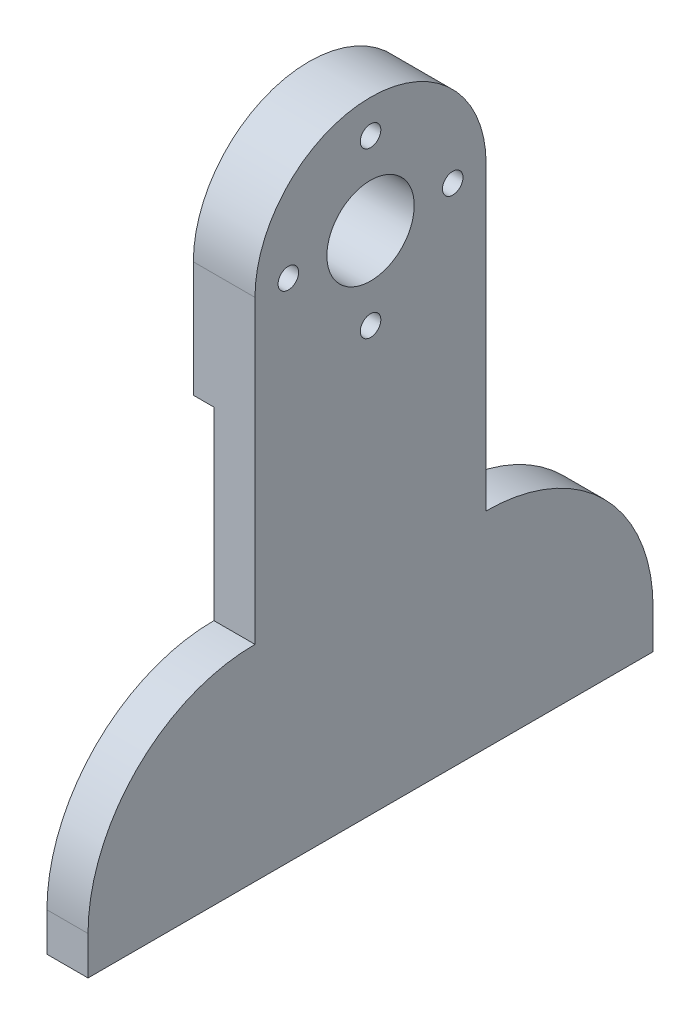
ISO-10303-21;
HEADER;
FILE_DESCRIPTION(('STEP AP214'),'2;1');
FILE_NAME('part.step','',(''),(''),'','','');
FILE_SCHEMA(('AUTOMOTIVE_DESIGN { 1 0 10303 214 1 1 1 1 }'));
ENDSEC;
DATA;
#1=APPLICATION_CONTEXT('core data for automotive mechanical design processes');
#2=APPLICATION_PROTOCOL_DEFINITION('international standard','automotive_design',2000,#1);
#3=PRODUCT_CONTEXT('',#1,'mechanical');
#4=PRODUCT('Part','Part','',(#3));
#5=PRODUCT_RELATED_PRODUCT_CATEGORY('part','',(#4));
#6=PRODUCT_DEFINITION_FORMATION('','',#4);
#7=PRODUCT_DEFINITION_CONTEXT('part definition',#1,'design');
#8=PRODUCT_DEFINITION('design','',#6,#7);
#9=PRODUCT_DEFINITION_SHAPE('','',#8);
#10=(LENGTH_UNIT() NAMED_UNIT(*) SI_UNIT(.MILLI.,.METRE.));
#11=(NAMED_UNIT(*) PLANE_ANGLE_UNIT() SI_UNIT($,.RADIAN.));
#12=(NAMED_UNIT(*) SI_UNIT($,.STERADIAN.) SOLID_ANGLE_UNIT());
#13=UNCERTAINTY_MEASURE_WITH_UNIT(LENGTH_MEASURE(1.E-05),#10,'distance_accuracy_value','');
#14=(GEOMETRIC_REPRESENTATION_CONTEXT(3) GLOBAL_UNCERTAINTY_ASSIGNED_CONTEXT((#13)) GLOBAL_UNIT_ASSIGNED_CONTEXT((#10,
#11,#12)) REPRESENTATION_CONTEXT('',''));
#15=CARTESIAN_POINT('',(0.,0.,0.));
#16=DIRECTION('',(0.,0.,1.));
#17=DIRECTION('',(1.,0.,0.));
#18=AXIS2_PLACEMENT_3D('',#15,#16,#17);
#19=CARTESIAN_POINT('',(19.,0.,-55.));
#20=DIRECTION('',(1.,0.,0.));
#21=DIRECTION('',(0.,1.,0.));
#22=AXIS2_PLACEMENT_3D('',#19,#20,#21);
#23=PLANE('',#22);
#24=CARTESIAN_POINT('',(19.,-12.75,-19.5000000000001));
#25=DIRECTION('',(1.,0.,0.));
#26=DIRECTION('',(0.,1.,0.));
#27=AXIS2_PLACEMENT_3D('',#24,#25,#26);
#28=CIRCLE('',#27,1.);
#29=CARTESIAN_POINT('',(19.,-11.75,-19.5000000000001));
#30=VERTEX_POINT('',#29);
#31=EDGE_CURVE('E257',#30,#30,#28,.F.);
#32=ORIENTED_EDGE('',*,*,#31,.F.);
#33=EDGE_LOOP('',(#32));
#34=FACE_BOUND('',#33,.T.);
#35=CARTESIAN_POINT('',(19.,-20.75,-27.5000000000002));
#36=DIRECTION('',(1.,0.,0.));
#37=DIRECTION('',(0.,1.,0.));
#38=AXIS2_PLACEMENT_3D('',#35,#36,#37);
#39=CIRCLE('',#38,1.);
#40=CARTESIAN_POINT('',(19.,-19.75,-27.5000000000002));
#41=VERTEX_POINT('',#40);
#42=EDGE_CURVE('E241',#41,#41,#39,.F.);
#43=ORIENTED_EDGE('',*,*,#42,.F.);
#44=EDGE_LOOP('',(#43));
#45=FACE_BOUND('',#44,.T.);
#46=CARTESIAN_POINT('',(19.,-4.75000000000001,-27.5));
#47=DIRECTION('',(1.,0.,0.));
#48=DIRECTION('',(0.,1.,0.));
#49=AXIS2_PLACEMENT_3D('',#46,#47,#48);
#50=CIRCLE('',#49,1.);
#51=CARTESIAN_POINT('',(19.,-3.75000000000001,-27.5));
#52=VERTEX_POINT('',#51);
#53=EDGE_CURVE('E225',#52,#52,#50,.F.);
#54=ORIENTED_EDGE('',*,*,#53,.F.);
#55=EDGE_LOOP('',(#54));
#56=FACE_BOUND('',#55,.T.);
#57=CARTESIAN_POINT('',(19.,-12.7499999999999,-35.5000000000001));
#58=DIRECTION('',(1.,0.,0.));
#59=DIRECTION('',(0.,1.,0.));
#60=AXIS2_PLACEMENT_3D('',#57,#58,#59);
#61=CIRCLE('',#60,1.00000000000001);
#62=CARTESIAN_POINT('',(19.,-11.7499999999999,-35.5000000000001));
#63=VERTEX_POINT('',#62);
#64=EDGE_CURVE('E233',#63,#63,#61,.F.);
#65=ORIENTED_EDGE('',*,*,#64,.F.);
#66=EDGE_LOOP('',(#65));
#67=FACE_BOUND('',#66,.T.);
#68=CARTESIAN_POINT('',(19.,-12.75,-27.5));
#69=DIRECTION('',(1.,0.,0.));
#70=DIRECTION('',(0.,1.,0.));
#71=AXIS2_PLACEMENT_3D('',#68,#69,#70);
#72=CIRCLE('',#71,4.25);
#73=CARTESIAN_POINT('',(19.,-8.50000000000001,-27.5));
#74=VERTEX_POINT('',#73);
#75=EDGE_CURVE('E249',#74,#74,#72,.F.);
#76=ORIENTED_EDGE('',*,*,#75,.F.);
#77=EDGE_LOOP('',(#76));
#78=FACE_BOUND('',#77,.T.);
#79=DIRECTION('',(0.,-1.,0.));
#80=VECTOR('',#79,1.);
#81=CARTESIAN_POINT('',(19.,0.,-38.75));
#82=LINE('',#81,#80);
#83=CARTESIAN_POINT('',(19.,-12.75,-38.75));
#84=VERTEX_POINT('',#83);
#85=CARTESIAN_POINT('',(19.,-24.,-38.75));
#86=VERTEX_POINT('',#85);
#87=EDGE_CURVE('E261',#84,#86,#82,.T.);
#88=ORIENTED_EDGE('',*,*,#87,.T.);
#89=DIRECTION('',(0.,0.,-1.));
#90=VECTOR('',#89,1.);
#91=CARTESIAN_POINT('',(19.,-24.,0.));
#92=LINE('',#91,#90);
#93=CARTESIAN_POINT('',(19.,-24.,-16.25));
#94=VERTEX_POINT('',#93);
#95=EDGE_CURVE('E200',#94,#86,#92,.T.);
#96=ORIENTED_EDGE('',*,*,#95,.F.);
#97=DIRECTION('',(0.,-1.,0.));
#98=VECTOR('',#97,1.);
#99=CARTESIAN_POINT('',(19.,0.,-16.25));
#100=LINE('',#99,#98);
#101=CARTESIAN_POINT('',(19.,-12.75,-16.25));
#102=VERTEX_POINT('',#101);
#103=EDGE_CURVE('E159',#102,#94,#100,.T.);
#104=ORIENTED_EDGE('',*,*,#103,.F.);
#105=CARTESIAN_POINT('',(19.,-12.75,-27.5));
#106=DIRECTION('',(1.,0.,0.));
#107=DIRECTION('',(0.,1.,0.));
#108=AXIS2_PLACEMENT_3D('',#105,#106,#107);
#109=CIRCLE('',#108,11.25);
#110=EDGE_CURVE('E216',#84,#102,#109,.T.);
#111=ORIENTED_EDGE('',*,*,#110,.F.);
#112=EDGE_LOOP('',(#88,#96,#104,#111));
#113=FACE_BOUND('',#112,.T.);
#114=ADVANCED_FACE('F47',(#34,#45,#56,#67,#78,#113),#23,.F.);
#115=CARTESIAN_POINT('',(-25.,-12.75,-19.5000000000001));
#116=DIRECTION('',(1.,0.,0.));
#117=DIRECTION('',(0.,1.,0.));
#118=AXIS2_PLACEMENT_3D('',#115,#116,#117);
#119=CYLINDRICAL_SURFACE('',#118,1.);
#120=ORIENTED_EDGE('',*,*,#31,.T.);
#121=EDGE_LOOP('',(#120));
#122=FACE_BOUND('',#121,.T.);
#123=CARTESIAN_POINT('',(25.,-12.75,-19.5000000000001));
#124=DIRECTION('',(1.,0.,0.));
#125=DIRECTION('',(0.,1.,0.));
#126=AXIS2_PLACEMENT_3D('',#123,#124,#125);
#127=CIRCLE('',#126,1.);
#128=CARTESIAN_POINT('',(25.,-11.75,-19.5000000000001));
#129=VERTEX_POINT('',#128);
#130=EDGE_CURVE('E253',#129,#129,#127,.T.);
#131=ORIENTED_EDGE('',*,*,#130,.T.);
#132=EDGE_LOOP('',(#131));
#133=FACE_BOUND('',#132,.T.);
#134=ADVANCED_FACE('F299',(#122,#133),#119,.F.);
#135=CARTESIAN_POINT('',(-25.,-12.75,-27.5));
#136=DIRECTION('',(1.,0.,0.));
#137=DIRECTION('',(0.,1.,0.));
#138=AXIS2_PLACEMENT_3D('',#135,#136,#137);
#139=CYLINDRICAL_SURFACE('',#138,4.25);
#140=ORIENTED_EDGE('',*,*,#75,.T.);
#141=EDGE_LOOP('',(#140));
#142=FACE_BOUND('',#141,.T.);
#143=CARTESIAN_POINT('',(25.,-12.75,-27.5));
#144=DIRECTION('',(1.,0.,0.));
#145=DIRECTION('',(0.,1.,0.));
#146=AXIS2_PLACEMENT_3D('',#143,#144,#145);
#147=CIRCLE('',#146,4.25);
#148=CARTESIAN_POINT('',(25.,-8.50000000000001,-27.5));
#149=VERTEX_POINT('',#148);
#150=EDGE_CURVE('E245',#149,#149,#147,.T.);
#151=ORIENTED_EDGE('',*,*,#150,.T.);
#152=EDGE_LOOP('',(#151));
#153=FACE_BOUND('',#152,.T.);
#154=ADVANCED_FACE('F305',(#142,#153),#139,.F.);
#155=CARTESIAN_POINT('',(-25.,-20.75,-27.5000000000002));
#156=DIRECTION('',(1.,0.,0.));
#157=DIRECTION('',(0.,1.,0.));
#158=AXIS2_PLACEMENT_3D('',#155,#156,#157);
#159=CYLINDRICAL_SURFACE('',#158,1.);
#160=ORIENTED_EDGE('',*,*,#42,.T.);
#161=EDGE_LOOP('',(#160));
#162=FACE_BOUND('',#161,.T.);
#163=CARTESIAN_POINT('',(25.,-20.75,-27.5000000000002));
#164=DIRECTION('',(1.,0.,0.));
#165=DIRECTION('',(0.,1.,0.));
#166=AXIS2_PLACEMENT_3D('',#163,#164,#165);
#167=CIRCLE('',#166,1.);
#168=CARTESIAN_POINT('',(25.,-19.75,-27.5000000000002));
#169=VERTEX_POINT('',#168);
#170=EDGE_CURVE('E237',#169,#169,#167,.T.);
#171=ORIENTED_EDGE('',*,*,#170,.T.);
#172=EDGE_LOOP('',(#171));
#173=FACE_BOUND('',#172,.T.);
#174=ADVANCED_FACE('F320',(#162,#173),#159,.F.);
#175=CARTESIAN_POINT('',(-25.,-12.7499999999999,-35.5000000000001));
#176=DIRECTION('',(1.,0.,0.));
#177=DIRECTION('',(0.,1.,0.));
#178=AXIS2_PLACEMENT_3D('',#175,#176,#177);
#179=CYLINDRICAL_SURFACE('',#178,1.00000000000001);
#180=ORIENTED_EDGE('',*,*,#64,.T.);
#181=EDGE_LOOP('',(#180));
#182=FACE_BOUND('',#181,.T.);
#183=CARTESIAN_POINT('',(25.,-12.7499999999999,-35.5000000000001));
#184=DIRECTION('',(1.,0.,0.));
#185=DIRECTION('',(0.,1.,0.));
#186=AXIS2_PLACEMENT_3D('',#183,#184,#185);
#187=CIRCLE('',#186,1.00000000000001);
#188=CARTESIAN_POINT('',(25.,-11.7499999999999,-35.5000000000001));
#189=VERTEX_POINT('',#188);
#190=EDGE_CURVE('E229',#189,#189,#187,.T.);
#191=ORIENTED_EDGE('',*,*,#190,.T.);
#192=EDGE_LOOP('',(#191));
#193=FACE_BOUND('',#192,.T.);
#194=ADVANCED_FACE('F324',(#182,#193),#179,.F.);
#195=CARTESIAN_POINT('',(-25.,-4.75000000000001,-27.5));
#196=DIRECTION('',(1.,0.,0.));
#197=DIRECTION('',(0.,1.,0.));
#198=AXIS2_PLACEMENT_3D('',#195,#196,#197);
#199=CYLINDRICAL_SURFACE('',#198,1.);
#200=ORIENTED_EDGE('',*,*,#53,.T.);
#201=EDGE_LOOP('',(#200));
#202=FACE_BOUND('',#201,.T.);
#203=CARTESIAN_POINT('',(25.,-4.75000000000001,-27.5));
#204=DIRECTION('',(1.,0.,0.));
#205=DIRECTION('',(0.,1.,0.));
#206=AXIS2_PLACEMENT_3D('',#203,#204,#205);
#207=CIRCLE('',#206,1.);
#208=CARTESIAN_POINT('',(25.,-3.75,-27.5));
#209=VERTEX_POINT('',#208);
#210=EDGE_CURVE('E221',#209,#209,#207,.T.);
#211=ORIENTED_EDGE('',*,*,#210,.T.);
#212=EDGE_LOOP('',(#211));
#213=FACE_BOUND('',#212,.T.);
#214=ADVANCED_FACE('F294',(#202,#213),#199,.F.);
#215=CARTESIAN_POINT('',(-25.0000000000001,-12.75,-27.5));
#216=DIRECTION('',(1.,0.,0.));
#217=DIRECTION('',(0.,1.,0.));
#218=AXIS2_PLACEMENT_3D('',#215,#216,#217);
#219=CYLINDRICAL_SURFACE('',#218,11.25);
#220=ORIENTED_EDGE('',*,*,#110,.T.);
#221=DIRECTION('',(1.,0.,0.));
#222=VECTOR('',#221,1.);
#223=CARTESIAN_POINT('',(-25.0000000000001,-12.75,-16.25));
#224=LINE('',#223,#222);
#225=CARTESIAN_POINT('',(25.,-12.75,-16.25));
#226=VERTEX_POINT('',#225);
#227=EDGE_CURVE('E213',#102,#226,#224,.T.);
#228=ORIENTED_EDGE('',*,*,#227,.T.);
#229=CARTESIAN_POINT('',(25.,-12.75,-27.5));
#230=DIRECTION('',(1.,0.,0.));
#231=DIRECTION('',(0.,1.,0.));
#232=AXIS2_PLACEMENT_3D('',#229,#230,#231);
#233=CIRCLE('',#232,11.25);
#234=CARTESIAN_POINT('',(25.,-12.75,-38.75));
#235=VERTEX_POINT('',#234);
#236=EDGE_CURVE('E181',#235,#226,#233,.T.);
#237=ORIENTED_EDGE('',*,*,#236,.F.);
#238=DIRECTION('',(1.,0.,0.));
#239=VECTOR('',#238,1.);
#240=CARTESIAN_POINT('',(-25.0000000000001,-12.75,-38.75));
#241=LINE('',#240,#239);
#242=EDGE_CURVE('E189',#84,#235,#241,.T.);
#243=ORIENTED_EDGE('',*,*,#242,.F.);
#244=EDGE_LOOP('',(#220,#228,#237,#243));
#245=FACE_BOUND('',#244,.T.);
#246=ADVANCED_FACE('F286',(#245),#219,.T.);
#247=CARTESIAN_POINT('',(-25.0000000000001,-58.25,-38.75));
#248=DIRECTION('',(1.,0.,0.));
#249=DIRECTION('',(0.,1.,0.));
#250=AXIS2_PLACEMENT_3D('',#247,#248,#249);
#251=CYLINDRICAL_SURFACE('',#250,16.25);
#252=CARTESIAN_POINT('',(21.,-58.25,-38.75));
#253=DIRECTION('',(1.,0.,0.));
#254=DIRECTION('',(0.,1.,0.));
#255=AXIS2_PLACEMENT_3D('',#252,#253,#254);
#256=CIRCLE('',#255,16.25);
#257=CARTESIAN_POINT('',(21.,-42.,-38.75));
#258=VERTEX_POINT('',#257);
#259=CARTESIAN_POINT('',(21.,-58.25,-55.));
#260=VERTEX_POINT('',#259);
#261=EDGE_CURVE('E190',#258,#260,#256,.F.);
#262=ORIENTED_EDGE('',*,*,#261,.F.);
#263=DIRECTION('',(1.,0.,0.));
#264=VECTOR('',#263,1.);
#265=CARTESIAN_POINT('',(-25.0000000000001,-42.,-38.75));
#266=LINE('',#265,#264);
#267=CARTESIAN_POINT('',(25.,-42.,-38.75));
#268=VERTEX_POINT('',#267);
#269=EDGE_CURVE('E122',#258,#268,#266,.T.);
#270=ORIENTED_EDGE('',*,*,#269,.T.);
#271=CARTESIAN_POINT('',(25.,-58.25,-38.75));
#272=DIRECTION('',(1.,0.,0.));
#273=DIRECTION('',(0.,1.,0.));
#274=AXIS2_PLACEMENT_3D('',#271,#272,#273);
#275=CIRCLE('',#274,16.25);
#276=CARTESIAN_POINT('',(25.,-58.25,-55.));
#277=VERTEX_POINT('',#276);
#278=EDGE_CURVE('E185',#277,#268,#275,.T.);
#279=ORIENTED_EDGE('',*,*,#278,.F.);
#280=DIRECTION('',(1.,0.,0.));
#281=VECTOR('',#280,1.);
#282=CARTESIAN_POINT('',(-25.0000000000001,-58.25,-55.));
#283=LINE('',#282,#281);
#284=EDGE_CURVE('E58',#260,#277,#283,.T.);
#285=ORIENTED_EDGE('',*,*,#284,.F.);
#286=EDGE_LOOP('',(#262,#270,#279,#285));
#287=FACE_BOUND('',#286,.T.);
#288=ADVANCED_FACE('F283',(#287),#251,.T.);
#289=CARTESIAN_POINT('',(-25.0000000000001,0.,-38.75));
#290=DIRECTION('',(0.,0.,1.));
#291=DIRECTION('',(1.,0.,0.));
#292=AXIS2_PLACEMENT_3D('',#289,#290,#291);
#293=PLANE('',#292);
#294=DIRECTION('',(0.,1.,0.));
#295=VECTOR('',#294,1.);
#296=CARTESIAN_POINT('',(21.,0.,-38.75));
#297=LINE('',#296,#295);
#298=CARTESIAN_POINT('',(21.,-24.,-38.75));
#299=VERTEX_POINT('',#298);
#300=EDGE_CURVE('E113',#258,#299,#297,.T.);
#301=ORIENTED_EDGE('',*,*,#300,.T.);
#302=DIRECTION('',(1.,0.,0.));
#303=VECTOR('',#302,1.);
#304=CARTESIAN_POINT('',(21.,-24.,-38.75));
#305=LINE('',#304,#303);
#306=EDGE_CURVE('E205',#86,#299,#305,.T.);
#307=ORIENTED_EDGE('',*,*,#306,.F.);
#308=ORIENTED_EDGE('',*,*,#87,.F.);
#309=ORIENTED_EDGE('',*,*,#242,.T.);
#310=DIRECTION('',(0.,-1.,0.));
#311=VECTOR('',#310,1.);
#312=CARTESIAN_POINT('',(25.,0.,-38.75));
#313=LINE('',#312,#311);
#314=EDGE_CURVE('E201',#235,#268,#313,.T.);
#315=ORIENTED_EDGE('',*,*,#314,.T.);
#316=ORIENTED_EDGE('',*,*,#269,.F.);
#317=EDGE_LOOP('',(#301,#307,#308,#309,#315,#316));
#318=FACE_BOUND('',#317,.T.);
#319=ADVANCED_FACE('F285',(#318),#293,.F.);
#320=CARTESIAN_POINT('',(21.,-24.,0.));
#321=DIRECTION('',(0.,1.,0.));
#322=DIRECTION('',(0.,0.,1.));
#323=AXIS2_PLACEMENT_3D('',#320,#321,#322);
#324=PLANE('',#323);
#325=DIRECTION('',(-1.,0.,0.));
#326=VECTOR('',#325,1.);
#327=CARTESIAN_POINT('',(-25.0000000000001,-24.,-16.25));
#328=LINE('',#327,#326);
#329=CARTESIAN_POINT('',(21.,-24.,-16.25));
#330=VERTEX_POINT('',#329);
#331=EDGE_CURVE('E197',#330,#94,#328,.T.);
#332=ORIENTED_EDGE('',*,*,#331,.T.);
#333=ORIENTED_EDGE('',*,*,#95,.T.);
#334=ORIENTED_EDGE('',*,*,#306,.T.);
#335=DIRECTION('',(0.,0.,-1.));
#336=VECTOR('',#335,1.);
#337=CARTESIAN_POINT('',(21.,-24.,0.));
#338=LINE('',#337,#336);
#339=EDGE_CURVE('E194',#330,#299,#338,.T.);
#340=ORIENTED_EDGE('',*,*,#339,.F.);
#341=EDGE_LOOP('',(#332,#333,#334,#340));
#342=FACE_BOUND('',#341,.T.);
#343=ADVANCED_FACE('F292',(#342),#324,.F.);
#344=CARTESIAN_POINT('',(-25.0000000000001,0.,-16.25));
#345=DIRECTION('',(0.,0.,1.));
#346=DIRECTION('',(1.,0.,0.));
#347=AXIS2_PLACEMENT_3D('',#344,#345,#346);
#348=PLANE('',#347);
#349=ORIENTED_EDGE('',*,*,#331,.F.);
#350=DIRECTION('',(0.,1.,0.));
#351=VECTOR('',#350,1.);
#352=CARTESIAN_POINT('',(21.,0.,-16.25));
#353=LINE('',#352,#351);
#354=CARTESIAN_POINT('',(21.,-42.,-16.25));
#355=VERTEX_POINT('',#354);
#356=EDGE_CURVE('E154',#355,#330,#353,.T.);
#357=ORIENTED_EDGE('',*,*,#356,.F.);
#358=DIRECTION('',(1.,0.,0.));
#359=VECTOR('',#358,1.);
#360=CARTESIAN_POINT('',(-25.0000000000001,-42.,-16.25));
#361=LINE('',#360,#359);
#362=CARTESIAN_POINT('',(25.,-42.,-16.25));
#363=VERTEX_POINT('',#362);
#364=EDGE_CURVE('E152',#355,#363,#361,.T.);
#365=ORIENTED_EDGE('',*,*,#364,.T.);
#366=DIRECTION('',(0.,-1.,0.));
#367=VECTOR('',#366,1.);
#368=CARTESIAN_POINT('',(25.,0.,-16.25));
#369=LINE('',#368,#367);
#370=EDGE_CURVE('E176',#226,#363,#369,.T.);
#371=ORIENTED_EDGE('',*,*,#370,.F.);
#372=ORIENTED_EDGE('',*,*,#227,.F.);
#373=ORIENTED_EDGE('',*,*,#103,.T.);
#374=EDGE_LOOP('',(#349,#357,#365,#371,#372,#373));
#375=FACE_BOUND('',#374,.T.);
#376=ADVANCED_FACE('F315',(#375),#348,.T.);
#377=CARTESIAN_POINT('',(-25.0000000000001,-58.25,-16.25));
#378=DIRECTION('',(1.,0.,0.));
#379=DIRECTION('',(0.,1.,0.));
#380=AXIS2_PLACEMENT_3D('',#377,#378,#379);
#381=CYLINDRICAL_SURFACE('',#380,16.25);
#382=CARTESIAN_POINT('',(21.,-58.25,-16.25));
#383=DIRECTION('',(1.,0.,0.));
#384=DIRECTION('',(0.,1.,0.));
#385=AXIS2_PLACEMENT_3D('',#382,#383,#384);
#386=CIRCLE('',#385,16.25);
#387=CARTESIAN_POINT('',(21.,-58.25,0.));
#388=VERTEX_POINT('',#387);
#389=EDGE_CURVE('E142',#388,#355,#386,.F.);
#390=ORIENTED_EDGE('',*,*,#389,.F.);
#391=DIRECTION('',(1.,0.,0.));
#392=VECTOR('',#391,1.);
#393=CARTESIAN_POINT('',(-25.0000000000001,-58.25,0.));
#394=LINE('',#393,#392);
#395=CARTESIAN_POINT('',(25.,-58.25,0.));
#396=VERTEX_POINT('',#395);
#397=EDGE_CURVE('E150',#388,#396,#394,.T.);
#398=ORIENTED_EDGE('',*,*,#397,.T.);
#399=CARTESIAN_POINT('',(25.,-58.25,-16.25));
#400=DIRECTION('',(1.,0.,0.));
#401=DIRECTION('',(0.,1.,0.));
#402=AXIS2_PLACEMENT_3D('',#399,#400,#401);
#403=CIRCLE('',#402,16.25);
#404=EDGE_CURVE('E174',#363,#396,#403,.T.);
#405=ORIENTED_EDGE('',*,*,#404,.F.);
#406=ORIENTED_EDGE('',*,*,#364,.F.);
#407=EDGE_LOOP('',(#390,#398,#405,#406));
#408=FACE_BOUND('',#407,.T.);
#409=ADVANCED_FACE('F148',(#408),#381,.T.);
#410=CARTESIAN_POINT('',(21.,0.,0.));
#411=DIRECTION('',(1.,0.,0.));
#412=DIRECTION('',(0.,1.,0.));
#413=AXIS2_PLACEMENT_3D('',#410,#411,#412);
#414=PLANE('',#413);
#415=DIRECTION('',(0.,-1.,0.));
#416=VECTOR('',#415,1.);
#417=CARTESIAN_POINT('',(21.,0.,-55.));
#418=LINE('',#417,#416);
#419=CARTESIAN_POINT('',(21.,-62.,-55.));
#420=VERTEX_POINT('',#419);
#421=EDGE_CURVE('E158',#260,#420,#418,.T.);
#422=ORIENTED_EDGE('',*,*,#421,.T.);
#423=DIRECTION('',(0.,0.,1.));
#424=VECTOR('',#423,1.);
#425=CARTESIAN_POINT('',(21.,-62.,0.));
#426=LINE('',#425,#424);
#427=CARTESIAN_POINT('',(21.,-62.,0.));
#428=VERTEX_POINT('',#427);
#429=EDGE_CURVE('E66',#420,#428,#426,.T.);
#430=ORIENTED_EDGE('',*,*,#429,.T.);
#431=DIRECTION('',(0.,-1.,0.));
#432=VECTOR('',#431,1.);
#433=CARTESIAN_POINT('',(21.,0.,0.));
#434=LINE('',#433,#432);
#435=EDGE_CURVE('E138',#388,#428,#434,.T.);
#436=ORIENTED_EDGE('',*,*,#435,.F.);
#437=ORIENTED_EDGE('',*,*,#389,.T.);
#438=ORIENTED_EDGE('',*,*,#356,.T.);
#439=ORIENTED_EDGE('',*,*,#339,.T.);
#440=ORIENTED_EDGE('',*,*,#300,.F.);
#441=ORIENTED_EDGE('',*,*,#261,.T.);
#442=EDGE_LOOP('',(#422,#430,#436,#437,#438,#439,#440,#441));
#443=FACE_BOUND('',#442,.T.);
#444=ADVANCED_FACE('F141',(#443),#414,.F.);
#445=CARTESIAN_POINT('',(25.,0.,-55.));
#446=DIRECTION('',(1.,0.,0.));
#447=DIRECTION('',(0.,1.,0.));
#448=AXIS2_PLACEMENT_3D('',#445,#446,#447);
#449=PLANE('',#448);
#450=DIRECTION('',(0.,0.,-1.));
#451=VECTOR('',#450,1.);
#452=CARTESIAN_POINT('',(25.,-62.,0.));
#453=LINE('',#452,#451);
#454=CARTESIAN_POINT('',(25.,-62.,0.));
#455=VERTEX_POINT('',#454);
#456=CARTESIAN_POINT('',(25.,-62.,-55.));
#457=VERTEX_POINT('',#456);
#458=EDGE_CURVE('E193',#455,#457,#453,.T.);
#459=ORIENTED_EDGE('',*,*,#458,.T.);
#460=DIRECTION('',(0.,1.,0.));
#461=VECTOR('',#460,1.);
#462=CARTESIAN_POINT('',(25.,0.,-55.));
#463=LINE('',#462,#461);
#464=EDGE_CURVE('E51',#457,#277,#463,.T.);
#465=ORIENTED_EDGE('',*,*,#464,.T.);
#466=ORIENTED_EDGE('',*,*,#278,.T.);
#467=ORIENTED_EDGE('',*,*,#314,.F.);
#468=ORIENTED_EDGE('',*,*,#236,.T.);
#469=ORIENTED_EDGE('',*,*,#370,.T.);
#470=ORIENTED_EDGE('',*,*,#404,.T.);
#471=DIRECTION('',(0.,1.,0.));
#472=VECTOR('',#471,1.);
#473=CARTESIAN_POINT('',(25.,0.,0.));
#474=LINE('',#473,#472);
#475=EDGE_CURVE('E84',#455,#396,#474,.T.);
#476=ORIENTED_EDGE('',*,*,#475,.F.);
#477=EDGE_LOOP('',(#459,#465,#466,#467,#468,#469,#470,#476));
#478=FACE_BOUND('',#477,.T.);
#479=ORIENTED_EDGE('',*,*,#210,.F.);
#480=EDGE_LOOP('',(#479));
#481=FACE_BOUND('',#480,.T.);
#482=ORIENTED_EDGE('',*,*,#190,.F.);
#483=EDGE_LOOP('',(#482));
#484=FACE_BOUND('',#483,.T.);
#485=ORIENTED_EDGE('',*,*,#170,.F.);
#486=EDGE_LOOP('',(#485));
#487=FACE_BOUND('',#486,.T.);
#488=ORIENTED_EDGE('',*,*,#150,.F.);
#489=EDGE_LOOP('',(#488));
#490=FACE_BOUND('',#489,.T.);
#491=ORIENTED_EDGE('',*,*,#130,.F.);
#492=EDGE_LOOP('',(#491));
#493=FACE_BOUND('',#492,.T.);
#494=ADVANCED_FACE('F278',(#478,#481,#484,#487,#490,#493),#449,.T.);
#495=CARTESIAN_POINT('',(0.,0.,0.));
#496=DIRECTION('',(0.,0.,1.));
#497=DIRECTION('',(1.,0.,0.));
#498=AXIS2_PLACEMENT_3D('',#495,#496,#497);
#499=PLANE('',#498);
#500=DIRECTION('',(-1.,0.,0.));
#501=VECTOR('',#500,1.);
#502=CARTESIAN_POINT('',(25.,-62.,0.));
#503=LINE('',#502,#501);
#504=EDGE_CURVE('E11',#455,#428,#503,.T.);
#505=ORIENTED_EDGE('',*,*,#504,.F.);
#506=ORIENTED_EDGE('',*,*,#475,.T.);
#507=ORIENTED_EDGE('',*,*,#397,.F.);
#508=ORIENTED_EDGE('',*,*,#435,.T.);
#509=EDGE_LOOP('',(#505,#506,#507,#508));
#510=FACE_BOUND('',#509,.T.);
#511=ADVANCED_FACE('F156',(#510),#499,.T.);
#512=CARTESIAN_POINT('',(0.,0.,-55.));
#513=DIRECTION('',(0.,0.,1.));
#514=DIRECTION('',(1.,0.,0.));
#515=AXIS2_PLACEMENT_3D('',#512,#513,#514);
#516=PLANE('',#515);
#517=ORIENTED_EDGE('',*,*,#464,.F.);
#518=DIRECTION('',(-1.,0.,0.));
#519=VECTOR('',#518,1.);
#520=CARTESIAN_POINT('',(25.,-62.,-55.));
#521=LINE('',#520,#519);
#522=EDGE_CURVE('E75',#457,#420,#521,.T.);
#523=ORIENTED_EDGE('',*,*,#522,.T.);
#524=ORIENTED_EDGE('',*,*,#421,.F.);
#525=ORIENTED_EDGE('',*,*,#284,.T.);
#526=EDGE_LOOP('',(#517,#523,#524,#525));
#527=FACE_BOUND('',#526,.T.);
#528=ADVANCED_FACE('F49',(#527),#516,.F.);
#529=CARTESIAN_POINT('',(25.,-62.,0.));
#530=DIRECTION('',(0.,1.,0.));
#531=DIRECTION('',(0.,0.,1.));
#532=AXIS2_PLACEMENT_3D('',#529,#530,#531);
#533=PLANE('',#532);
#534=ORIENTED_EDGE('',*,*,#522,.F.);
#535=ORIENTED_EDGE('',*,*,#458,.F.);
#536=ORIENTED_EDGE('',*,*,#504,.T.);
#537=ORIENTED_EDGE('',*,*,#429,.F.);
#538=EDGE_LOOP('',(#534,#535,#536,#537));
#539=FACE_BOUND('',#538,.T.);
#540=ADVANCED_FACE('F379',(#539),#533,.F.);
#541=CLOSED_SHELL('',(#114,#134,#154,#174,#194,#214,#246,#288,#319,#343,#376,#409,#444,#494,
#511,#528,#540));
#542=MANIFOLD_SOLID_BREP('B2',#541);
#543=ADVANCED_BREP_SHAPE_REPRESENTATION('',(#18,#542),#14);
#544=SHAPE_DEFINITION_REPRESENTATION(#9,#543);
ENDSEC;
END-ISO-10303-21;
